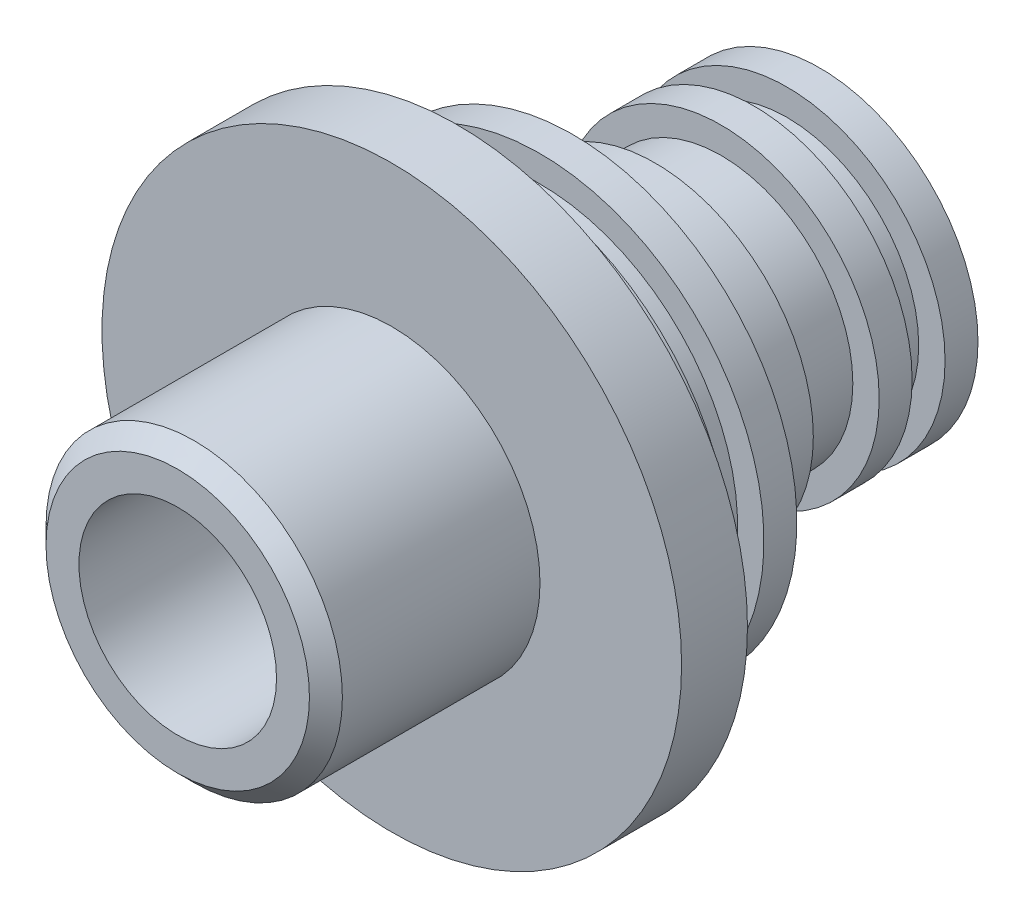
ISO-10303-21;
HEADER;
FILE_DESCRIPTION(('STEP AP214'),'2;1');
FILE_NAME('part.step','',(''),(''),'','','');
FILE_SCHEMA(('AUTOMOTIVE_DESIGN { 1 0 10303 214 1 1 1 1 }'));
ENDSEC;
DATA;
#1=APPLICATION_CONTEXT('core data for automotive mechanical design processes');
#2=APPLICATION_PROTOCOL_DEFINITION('international standard','automotive_design',2000,#1);
#3=PRODUCT_CONTEXT('',#1,'mechanical');
#4=PRODUCT('Part','Part','',(#3));
#5=PRODUCT_RELATED_PRODUCT_CATEGORY('part','',(#4));
#6=PRODUCT_DEFINITION_FORMATION('','',#4);
#7=PRODUCT_DEFINITION_CONTEXT('part definition',#1,'design');
#8=PRODUCT_DEFINITION('design','',#6,#7);
#9=PRODUCT_DEFINITION_SHAPE('','',#8);
#10=(LENGTH_UNIT() NAMED_UNIT(*) SI_UNIT(.MILLI.,.METRE.));
#11=(NAMED_UNIT(*) PLANE_ANGLE_UNIT() SI_UNIT($,.RADIAN.));
#12=(NAMED_UNIT(*) SI_UNIT($,.STERADIAN.) SOLID_ANGLE_UNIT());
#13=UNCERTAINTY_MEASURE_WITH_UNIT(LENGTH_MEASURE(1.E-05),#10,'distance_accuracy_value','');
#14=(GEOMETRIC_REPRESENTATION_CONTEXT(3) GLOBAL_UNCERTAINTY_ASSIGNED_CONTEXT((#13)) GLOBAL_UNIT_ASSIGNED_CONTEXT((#10,
#11,#12)) REPRESENTATION_CONTEXT('',''));
#15=CARTESIAN_POINT('',(0.,0.,0.));
#16=DIRECTION('',(0.,0.,1.));
#17=DIRECTION('',(1.,0.,0.));
#18=AXIS2_PLACEMENT_3D('',#15,#16,#17);
#19=CARTESIAN_POINT('',(0.,0.,7.5));
#20=DIRECTION('',(0.,0.,-1.));
#21=DIRECTION('',(-1.,0.,0.));
#22=AXIS2_PLACEMENT_3D('',#19,#20,#21);
#23=CYLINDRICAL_SURFACE('',#22,4.8);
#24=CARTESIAN_POINT('',(0.,0.,7.5));
#25=DIRECTION('',(0.,0.,-1.));
#26=DIRECTION('',(-1.,0.,0.));
#27=AXIS2_PLACEMENT_3D('',#24,#25,#26);
#28=CIRCLE('',#27,4.8);
#29=CARTESIAN_POINT('',(-4.8,0.,7.5));
#30=VERTEX_POINT('',#29);
#31=EDGE_CURVE('E92',#30,#30,#28,.T.);
#32=ORIENTED_EDGE('',*,*,#31,.T.);
#33=EDGE_LOOP('',(#32));
#34=FACE_BOUND('',#33,.T.);
#35=CARTESIAN_POINT('',(0.,0.,5.));
#36=DIRECTION('',(0.,0.,-1.));
#37=DIRECTION('',(-1.,0.,0.));
#38=AXIS2_PLACEMENT_3D('',#35,#36,#37);
#39=CIRCLE('',#38,4.8);
#40=CARTESIAN_POINT('',(-4.8,0.,5.));
#41=VERTEX_POINT('',#40);
#42=EDGE_CURVE('E64',#41,#41,#39,.F.);
#43=ORIENTED_EDGE('',*,*,#42,.T.);
#44=EDGE_LOOP('',(#43));
#45=FACE_BOUND('',#44,.T.);
#46=ADVANCED_FACE('F45',(#34,#45),#23,.T.);
#47=CARTESIAN_POINT('',(0.,0.,3.));
#48=DIRECTION('',(0.,0.,-1.));
#49=DIRECTION('',(-1.,0.,0.));
#50=AXIS2_PLACEMENT_3D('',#47,#48,#49);
#51=CIRCLE('',#50,4.8);
#52=CARTESIAN_POINT('',(-4.8,0.,3.));
#53=VERTEX_POINT('',#52);
#54=EDGE_CURVE('E68',#53,#53,#51,.F.);
#55=ORIENTED_EDGE('',*,*,#54,.F.);
#56=EDGE_LOOP('',(#55));
#57=FACE_BOUND('',#56,.T.);
#58=CARTESIAN_POINT('',(0.,0.,2.));
#59=DIRECTION('',(0.,0.,-1.));
#60=DIRECTION('',(-1.,0.,0.));
#61=AXIS2_PLACEMENT_3D('',#58,#59,#60);
#62=CIRCLE('',#61,4.8);
#63=CARTESIAN_POINT('',(-4.8,0.,2.));
#64=VERTEX_POINT('',#63);
#65=EDGE_CURVE('E72',#64,#64,#62,.F.);
#66=ORIENTED_EDGE('',*,*,#65,.T.);
#67=EDGE_LOOP('',(#66));
#68=FACE_BOUND('',#67,.T.);
#69=ADVANCED_FACE('F145',(#57,#68),#23,.T.);
#70=CARTESIAN_POINT('',(0.,0.,38.1390602847441));
#71=DIRECTION('',(0.,0.,-1.));
#72=DIRECTION('',(-1.,0.,0.));
#73=AXIS2_PLACEMENT_3D('',#70,#71,#72);
#74=CYLINDRICAL_SURFACE('',#73,6.8);
#75=CARTESIAN_POINT('',(0.,0.,11.));
#76=DIRECTION('',(0.,0.,1.));
#77=DIRECTION('',(1.,0.,0.));
#78=AXIS2_PLACEMENT_3D('',#75,#76,#77);
#79=CIRCLE('',#78,6.8);
#80=CARTESIAN_POINT('',(6.8,0.,11.));
#81=VERTEX_POINT('',#80);
#82=EDGE_CURVE('E91',#81,#81,#79,.F.);
#83=ORIENTED_EDGE('',*,*,#82,.T.);
#84=EDGE_LOOP('',(#83));
#85=FACE_BOUND('',#84,.T.);
#86=CARTESIAN_POINT('',(0.,0.,9.5));
#87=DIRECTION('',(0.,0.,-1.));
#88=DIRECTION('',(-1.,0.,0.));
#89=AXIS2_PLACEMENT_3D('',#86,#87,#88);
#90=CIRCLE('',#89,6.8);
#91=CARTESIAN_POINT('',(-6.8,0.,9.5));
#92=VERTEX_POINT('',#91);
#93=EDGE_CURVE('E80',#92,#92,#90,.F.);
#94=ORIENTED_EDGE('',*,*,#93,.T.);
#95=EDGE_LOOP('',(#94));
#96=FACE_BOUND('',#95,.T.);
#97=ADVANCED_FACE('F152',(#85,#96),#74,.T.);
#98=CARTESIAN_POINT('',(0.,0.,0.));
#99=DIRECTION('',(0.,0.,1.));
#100=DIRECTION('',(1.,0.,0.));
#101=AXIS2_PLACEMENT_3D('',#98,#99,#100);
#102=PLANE('',#101);
#103=CARTESIAN_POINT('',(0.,0.,0.));
#104=DIRECTION('',(0.,0.,1.));
#105=DIRECTION('',(1.,0.,0.));
#106=AXIS2_PLACEMENT_3D('',#103,#104,#105);
#107=CIRCLE('',#106,3.);
#108=CARTESIAN_POINT('',(3.,0.,0.));
#109=VERTEX_POINT('',#108);
#110=EDGE_CURVE('E61',#109,#109,#107,.T.);
#111=ORIENTED_EDGE('',*,*,#110,.T.);
#112=EDGE_LOOP('',(#111));
#113=FACE_BOUND('',#112,.T.);
#114=CARTESIAN_POINT('',(0.,0.,0.));
#115=DIRECTION('',(0.,0.,-1.));
#116=DIRECTION('',(-1.,0.,0.));
#117=AXIS2_PLACEMENT_3D('',#114,#115,#116);
#118=CIRCLE('',#117,4.8);
#119=CARTESIAN_POINT('',(-4.8,0.,0.));
#120=VERTEX_POINT('',#119);
#121=EDGE_CURVE('E83',#120,#120,#118,.T.);
#122=ORIENTED_EDGE('',*,*,#121,.T.);
#123=EDGE_LOOP('',(#122));
#124=FACE_BOUND('',#123,.T.);
#125=ADVANCED_FACE('F174',(#113,#124),#102,.F.);
#126=CARTESIAN_POINT('',(0.,0.,8.5));
#127=DIRECTION('',(0.,0.,-1.));
#128=DIRECTION('',(-1.,0.,0.));
#129=AXIS2_PLACEMENT_3D('',#126,#127,#128);
#130=CIRCLE('',#129,6.8);
#131=CARTESIAN_POINT('',(-6.8,0.,8.5));
#132=VERTEX_POINT('',#131);
#133=EDGE_CURVE('E84',#132,#132,#130,.F.);
#134=ORIENTED_EDGE('',*,*,#133,.F.);
#135=EDGE_LOOP('',(#134));
#136=FACE_BOUND('',#135,.T.);
#137=CARTESIAN_POINT('',(0.,0.,7.5));
#138=DIRECTION('',(0.,0.,-1.));
#139=DIRECTION('',(-1.,0.,0.));
#140=AXIS2_PLACEMENT_3D('',#137,#138,#139);
#141=CIRCLE('',#140,6.8);
#142=CARTESIAN_POINT('',(-6.8,0.,7.5));
#143=VERTEX_POINT('',#142);
#144=EDGE_CURVE('E88',#143,#143,#141,.F.);
#145=ORIENTED_EDGE('',*,*,#144,.T.);
#146=EDGE_LOOP('',(#145));
#147=FACE_BOUND('',#146,.T.);
#148=ADVANCED_FACE('F176',(#136,#147),#74,.T.);
#149=CARTESIAN_POINT('',(0.,0.,19.5));
#150=DIRECTION('',(0.,0.,1.));
#151=DIRECTION('',(1.,0.,0.));
#152=AXIS2_PLACEMENT_3D('',#149,#150,#151);
#153=PLANE('',#152);
#154=CARTESIAN_POINT('',(0.,0.,19.5));
#155=DIRECTION('',(0.,0.,1.));
#156=DIRECTION('',(1.,0.,0.));
#157=AXIS2_PLACEMENT_3D('',#154,#155,#156);
#158=CIRCLE('',#157,4.00000000000001);
#159=CARTESIAN_POINT('',(4.00000000000001,0.,19.5));
#160=VERTEX_POINT('',#159);
#161=EDGE_CURVE('E53',#160,#160,#158,.T.);
#162=ORIENTED_EDGE('',*,*,#161,.T.);
#163=EDGE_LOOP('',(#162));
#164=FACE_BOUND('',#163,.T.);
#165=CARTESIAN_POINT('',(0.,0.,19.5));
#166=DIRECTION('',(0.,0.,1.));
#167=DIRECTION('',(1.,0.,0.));
#168=AXIS2_PLACEMENT_3D('',#165,#166,#167);
#169=CIRCLE('',#168,3.);
#170=CARTESIAN_POINT('',(3.,0.,19.5));
#171=VERTEX_POINT('',#170);
#172=EDGE_CURVE('E57',#171,#171,#169,.T.);
#173=ORIENTED_EDGE('',*,*,#172,.F.);
#174=EDGE_LOOP('',(#173));
#175=FACE_BOUND('',#174,.T.);
#176=ADVANCED_FACE('F183',(#164,#175),#153,.T.);
#177=CARTESIAN_POINT('',(0.,0.,19.5));
#178=DIRECTION('',(0.,0.,-1.));
#179=DIRECTION('',(-1.,0.,0.));
#180=AXIS2_PLACEMENT_3D('',#177,#178,#179);
#181=CYLINDRICAL_SURFACE('',#180,8.8);
#182=CARTESIAN_POINT('',(0.,0.,11.));
#183=DIRECTION('',(0.,0.,1.));
#184=DIRECTION('',(1.,0.,0.));
#185=AXIS2_PLACEMENT_3D('',#182,#183,#184);
#186=CIRCLE('',#185,8.8);
#187=CARTESIAN_POINT('',(8.8,0.,11.));
#188=VERTEX_POINT('',#187);
#189=EDGE_CURVE('E93',#188,#188,#186,.T.);
#190=ORIENTED_EDGE('',*,*,#189,.T.);
#191=EDGE_LOOP('',(#190));
#192=FACE_BOUND('',#191,.T.);
#193=CARTESIAN_POINT('',(0.,0.,13.));
#194=DIRECTION('',(0.,0.,1.));
#195=DIRECTION('',(1.,0.,0.));
#196=AXIS2_PLACEMENT_3D('',#193,#194,#195);
#197=CIRCLE('',#196,8.8);
#198=CARTESIAN_POINT('',(8.8,0.,13.));
#199=VERTEX_POINT('',#198);
#200=EDGE_CURVE('E97',#199,#199,#197,.T.);
#201=ORIENTED_EDGE('',*,*,#200,.F.);
#202=EDGE_LOOP('',(#201));
#203=FACE_BOUND('',#202,.T.);
#204=ADVANCED_FACE('F189',(#192,#203),#181,.T.);
#205=CARTESIAN_POINT('',(0.,0.,19.5));
#206=DIRECTION('',(0.,0.,-1.));
#207=DIRECTION('',(-1.,0.,0.));
#208=AXIS2_PLACEMENT_3D('',#205,#206,#207);
#209=CYLINDRICAL_SURFACE('',#208,3.);
#210=ORIENTED_EDGE('',*,*,#172,.T.);
#211=EDGE_LOOP('',(#210));
#212=FACE_BOUND('',#211,.T.);
#213=ORIENTED_EDGE('',*,*,#110,.F.);
#214=EDGE_LOOP('',(#213));
#215=FACE_BOUND('',#214,.T.);
#216=ADVANCED_FACE('F191',(#212,#215),#209,.F.);
#217=CARTESIAN_POINT('',(0.,0.,13.));
#218=DIRECTION('',(0.,0.,1.));
#219=DIRECTION('',(1.,0.,0.));
#220=AXIS2_PLACEMENT_3D('',#217,#218,#219);
#221=PLANE('',#220);
#222=CARTESIAN_POINT('',(0.,0.,13.));
#223=DIRECTION('',(0.,0.,1.));
#224=DIRECTION('',(1.,0.,0.));
#225=AXIS2_PLACEMENT_3D('',#222,#223,#224);
#226=CIRCLE('',#225,4.5);
#227=CARTESIAN_POINT('',(4.5,0.,13.));
#228=VERTEX_POINT('',#227);
#229=EDGE_CURVE('E96',#228,#228,#226,.T.);
#230=ORIENTED_EDGE('',*,*,#229,.F.);
#231=EDGE_LOOP('',(#230));
#232=FACE_BOUND('',#231,.T.);
#233=ORIENTED_EDGE('',*,*,#200,.T.);
#234=EDGE_LOOP('',(#233));
#235=FACE_BOUND('',#234,.T.);
#236=ADVANCED_FACE('F197',(#232,#235),#221,.T.);
#237=CARTESIAN_POINT('',(0.,0.,13.));
#238=DIRECTION('',(0.,0.,1.));
#239=DIRECTION('',(1.,0.,0.));
#240=AXIS2_PLACEMENT_3D('',#237,#238,#239);
#241=CYLINDRICAL_SURFACE('',#240,4.5);
#242=CARTESIAN_POINT('',(0.,0.,19.));
#243=DIRECTION('',(0.,0.,1.));
#244=DIRECTION('',(1.,0.,0.));
#245=AXIS2_PLACEMENT_3D('',#242,#243,#244);
#246=CIRCLE('',#245,4.5);
#247=CARTESIAN_POINT('',(4.5,0.,19.));
#248=VERTEX_POINT('',#247);
#249=EDGE_CURVE('E12',#248,#248,#246,.F.);
#250=CARTESIAN_POINT('',(4.5,0.,19.));
#251=CARTESIAN_POINT('',(4.5,0.,18.9375));
#252=CARTESIAN_POINT('',(4.5,0.,18.875));
#253=CARTESIAN_POINT('',(4.5,0.,18.75));
#254=CARTESIAN_POINT('',(4.5,0.,18.6875));
#255=CARTESIAN_POINT('',(4.5,0.,18.5625));
#256=CARTESIAN_POINT('',(4.5,0.,18.5));
#257=CARTESIAN_POINT('',(4.5,0.,18.375));
#258=CARTESIAN_POINT('',(4.5,0.,18.3125));
#259=CARTESIAN_POINT('',(4.5,0.,18.1875));
#260=CARTESIAN_POINT('',(4.5,0.,18.125));
#261=CARTESIAN_POINT('',(4.5,0.,18.));
#262=CARTESIAN_POINT('',(4.5,0.,17.9375));
#263=CARTESIAN_POINT('',(4.5,0.,17.8125));
#264=CARTESIAN_POINT('',(4.5,0.,17.75));
#265=CARTESIAN_POINT('',(4.5,0.,17.625));
#266=CARTESIAN_POINT('',(4.5,0.,17.5625));
#267=CARTESIAN_POINT('',(4.5,0.,17.4375));
#268=CARTESIAN_POINT('',(4.5,0.,17.375));
#269=CARTESIAN_POINT('',(4.5,0.,17.25));
#270=CARTESIAN_POINT('',(4.5,0.,17.1875));
#271=CARTESIAN_POINT('',(4.5,0.,17.0625));
#272=CARTESIAN_POINT('',(4.5,0.,17.));
#273=CARTESIAN_POINT('',(4.5,0.,16.875));
#274=CARTESIAN_POINT('',(4.5,0.,16.8125));
#275=CARTESIAN_POINT('',(4.5,0.,16.6875));
#276=CARTESIAN_POINT('',(4.5,0.,16.625));
#277=CARTESIAN_POINT('',(4.5,0.,16.5));
#278=CARTESIAN_POINT('',(4.5,0.,16.4375));
#279=CARTESIAN_POINT('',(4.5,0.,16.3125));
#280=CARTESIAN_POINT('',(4.5,0.,16.25));
#281=CARTESIAN_POINT('',(4.5,0.,16.125));
#282=CARTESIAN_POINT('',(4.5,0.,16.0625));
#283=CARTESIAN_POINT('',(4.5,0.,15.9375));
#284=CARTESIAN_POINT('',(4.5,0.,15.875));
#285=CARTESIAN_POINT('',(4.5,0.,15.75));
#286=CARTESIAN_POINT('',(4.5,0.,15.6875));
#287=CARTESIAN_POINT('',(4.5,0.,15.5625));
#288=CARTESIAN_POINT('',(4.5,0.,15.5));
#289=CARTESIAN_POINT('',(4.5,0.,15.375));
#290=CARTESIAN_POINT('',(4.5,0.,15.3125));
#291=CARTESIAN_POINT('',(4.5,0.,15.1875));
#292=CARTESIAN_POINT('',(4.5,0.,15.125));
#293=CARTESIAN_POINT('',(4.5,0.,15.));
#294=CARTESIAN_POINT('',(4.5,0.,14.9375));
#295=CARTESIAN_POINT('',(4.5,0.,14.8125));
#296=CARTESIAN_POINT('',(4.5,0.,14.75));
#297=CARTESIAN_POINT('',(4.5,0.,14.625));
#298=CARTESIAN_POINT('',(4.5,0.,14.5625));
#299=CARTESIAN_POINT('',(4.5,0.,14.4375));
#300=CARTESIAN_POINT('',(4.5,0.,14.375));
#301=CARTESIAN_POINT('',(4.5,0.,14.25));
#302=CARTESIAN_POINT('',(4.5,0.,14.1875));
#303=CARTESIAN_POINT('',(4.5,0.,14.0625));
#304=CARTESIAN_POINT('',(4.5,0.,14.));
#305=CARTESIAN_POINT('',(4.5,0.,13.875));
#306=CARTESIAN_POINT('',(4.5,0.,13.8125));
#307=CARTESIAN_POINT('',(4.5,0.,13.6875));
#308=CARTESIAN_POINT('',(4.5,0.,13.625));
#309=CARTESIAN_POINT('',(4.5,0.,13.5));
#310=CARTESIAN_POINT('',(4.5,0.,13.4375));
#311=CARTESIAN_POINT('',(4.5,0.,13.3125));
#312=CARTESIAN_POINT('',(4.5,0.,13.25));
#313=CARTESIAN_POINT('',(4.5,0.,13.125));
#314=CARTESIAN_POINT('',(4.5,0.,13.0625));
#315=CARTESIAN_POINT('',(4.5,0.,13.));
#316=B_SPLINE_CURVE_WITH_KNOTS('',3,(#250,#251,#252,#253,#254,#255,#256,#257,#258,#259,#260,
#261,#262,#263,#264,#265,#266,#267,#268,#269,#270,#271,#272,#273,#274,#275,#276,#277,#278,#279,
#280,#281,#282,#283,#284,#285,#286,#287,#288,#289,#290,#291,#292,#293,#294,#295,#296,#297,#298,
#299,#300,#301,#302,#303,#304,#305,#306,#307,#308,#309,#310,#311,#312,#313,#314,#315),
.UNSPECIFIED.,.F.,.F.,(4,2,2,2,2,2,2,2,2,2,2,2,2,2,2,2,2,2,2,2,2,2,2,2,2,2,2,2,2,2,2,2,4),(0.,
0.1875,0.375000000000004,0.562500000000004,0.750000000000004,0.937500000000004,1.125,1.3125,1.5,
1.6875,1.87500000000001,2.06250000000001,2.25000000000001,2.43750000000001,2.62500000000001,
2.81250000000001,3.00000000000001,3.18750000000001,3.37500000000001,3.56250000000001,
3.75000000000001,3.93750000000001,4.12500000000001,4.31250000000001,4.50000000000001,
4.68750000000001,4.87500000000001,5.06250000000001,5.25000000000001,5.43750000000001,
5.62500000000001,5.81250000000001,6.00000000000001),.UNSPECIFIED.);
#317=EDGE_CURVE('BSEAM204',#248,#228,#316,.T.);
#318=ORIENTED_EDGE('',*,*,#249,.T.);
#319=ORIENTED_EDGE('',*,*,#229,.T.);
#320=ORIENTED_EDGE('',*,*,#317,.T.);
#321=ORIENTED_EDGE('',*,*,#317,.F.);
#322=EDGE_LOOP('',(#318,#320,#319,#321));
#323=FACE_BOUND('',#322,.T.);
#324=ADVANCED_FACE('F204',(#323),#241,.T.);
#325=CARTESIAN_POINT('',(0.,0.,11.));
#326=DIRECTION('',(0.,0.,1.));
#327=DIRECTION('',(1.,0.,0.));
#328=AXIS2_PLACEMENT_3D('',#325,#326,#327);
#329=PLANE('',#328);
#330=ORIENTED_EDGE('',*,*,#82,.F.);
#331=EDGE_LOOP('',(#330));
#332=FACE_BOUND('',#331,.T.);
#333=ORIENTED_EDGE('',*,*,#189,.F.);
#334=EDGE_LOOP('',(#333));
#335=FACE_BOUND('',#334,.T.);
#336=ADVANCED_FACE('F168',(#332,#335),#329,.F.);
#337=CARTESIAN_POINT('',(0.,0.,7.5));
#338=DIRECTION('',(0.,0.,-1.));
#339=DIRECTION('',(-1.,0.,0.));
#340=AXIS2_PLACEMENT_3D('',#337,#338,#339);
#341=PLANE('',#340);
#342=ORIENTED_EDGE('',*,*,#144,.F.);
#343=EDGE_LOOP('',(#342));
#344=FACE_BOUND('',#343,.T.);
#345=ORIENTED_EDGE('',*,*,#31,.F.);
#346=EDGE_LOOP('',(#345));
#347=FACE_BOUND('',#346,.T.);
#348=ADVANCED_FACE('F159',(#344,#347),#341,.T.);
#349=CARTESIAN_POINT('',(0.,0.,1.));
#350=DIRECTION('',(0.,0.,-1.));
#351=DIRECTION('',(-1.,0.,0.));
#352=AXIS2_PLACEMENT_3D('',#349,#350,#351);
#353=CIRCLE('',#352,4.8);
#354=CARTESIAN_POINT('',(-4.8,0.,1.));
#355=VERTEX_POINT('',#354);
#356=EDGE_CURVE('E76',#355,#355,#353,.F.);
#357=ORIENTED_EDGE('',*,*,#356,.F.);
#358=EDGE_LOOP('',(#357));
#359=FACE_BOUND('',#358,.T.);
#360=ORIENTED_EDGE('',*,*,#121,.F.);
#361=EDGE_LOOP('',(#360));
#362=FACE_BOUND('',#361,.T.);
#363=ADVANCED_FACE('F148',(#359,#362),#23,.T.);
#364=CARTESIAN_POINT('',(0.,0.,9.5));
#365=DIRECTION('',(0.,0.,-1.));
#366=DIRECTION('',(-1.,0.,0.));
#367=AXIS2_PLACEMENT_3D('',#364,#365,#366);
#368=PLANE('',#367);
#369=ORIENTED_EDGE('',*,*,#93,.F.);
#370=EDGE_LOOP('',(#369));
#371=FACE_BOUND('',#370,.T.);
#372=CARTESIAN_POINT('',(0.,0.,9.5));
#373=DIRECTION('',(0.,0.,-1.));
#374=DIRECTION('',(-1.,0.,0.));
#375=AXIS2_PLACEMENT_3D('',#372,#373,#374);
#376=CIRCLE('',#375,6.);
#377=CARTESIAN_POINT('',(-6.,0.,9.5));
#378=VERTEX_POINT('',#377);
#379=EDGE_CURVE('E87',#378,#378,#376,.T.);
#380=ORIENTED_EDGE('',*,*,#379,.F.);
#381=EDGE_LOOP('',(#380));
#382=FACE_BOUND('',#381,.T.);
#383=ADVANCED_FACE('F158',(#371,#382),#368,.T.);
#384=CARTESIAN_POINT('',(0.,0.,8.5));
#385=DIRECTION('',(0.,0.,-1.));
#386=DIRECTION('',(-1.,0.,0.));
#387=AXIS2_PLACEMENT_3D('',#384,#385,#386);
#388=PLANE('',#387);
#389=ORIENTED_EDGE('',*,*,#133,.T.);
#390=EDGE_LOOP('',(#389));
#391=FACE_BOUND('',#390,.T.);
#392=CARTESIAN_POINT('',(0.,0.,8.5));
#393=DIRECTION('',(0.,0.,-1.));
#394=DIRECTION('',(-1.,0.,0.));
#395=AXIS2_PLACEMENT_3D('',#392,#393,#394);
#396=CIRCLE('',#395,6.);
#397=CARTESIAN_POINT('',(-6.,0.,8.5));
#398=VERTEX_POINT('',#397);
#399=EDGE_CURVE('E75',#398,#398,#396,.T.);
#400=ORIENTED_EDGE('',*,*,#399,.T.);
#401=EDGE_LOOP('',(#400));
#402=FACE_BOUND('',#401,.T.);
#403=ADVANCED_FACE('F165',(#391,#402),#388,.F.);
#404=CARTESIAN_POINT('',(0.,0.,9.5));
#405=DIRECTION('',(0.,0.,-1.));
#406=DIRECTION('',(-1.,0.,0.));
#407=AXIS2_PLACEMENT_3D('',#404,#405,#406);
#408=CYLINDRICAL_SURFACE('',#407,6.);
#409=ORIENTED_EDGE('',*,*,#379,.T.);
#410=EDGE_LOOP('',(#409));
#411=FACE_BOUND('',#410,.T.);
#412=ORIENTED_EDGE('',*,*,#399,.F.);
#413=EDGE_LOOP('',(#412));
#414=FACE_BOUND('',#413,.T.);
#415=ADVANCED_FACE('F224',(#411,#414),#408,.T.);
#416=CARTESIAN_POINT('',(0.,0.,2.));
#417=DIRECTION('',(0.,0.,-1.));
#418=DIRECTION('',(-1.,0.,0.));
#419=AXIS2_PLACEMENT_3D('',#416,#417,#418);
#420=PLANE('',#419);
#421=ORIENTED_EDGE('',*,*,#65,.F.);
#422=EDGE_LOOP('',(#421));
#423=FACE_BOUND('',#422,.T.);
#424=CARTESIAN_POINT('',(0.,0.,2.));
#425=DIRECTION('',(0.,0.,-1.));
#426=DIRECTION('',(-1.,0.,0.));
#427=AXIS2_PLACEMENT_3D('',#424,#425,#426);
#428=CIRCLE('',#427,4.);
#429=CARTESIAN_POINT('',(-4.,0.,2.));
#430=VERTEX_POINT('',#429);
#431=EDGE_CURVE('E79',#430,#430,#428,.T.);
#432=ORIENTED_EDGE('',*,*,#431,.F.);
#433=EDGE_LOOP('',(#432));
#434=FACE_BOUND('',#433,.T.);
#435=ADVANCED_FACE('F227',(#423,#434),#420,.T.);
#436=CARTESIAN_POINT('',(0.,0.,1.));
#437=DIRECTION('',(0.,0.,-1.));
#438=DIRECTION('',(-1.,0.,0.));
#439=AXIS2_PLACEMENT_3D('',#436,#437,#438);
#440=PLANE('',#439);
#441=ORIENTED_EDGE('',*,*,#356,.T.);
#442=EDGE_LOOP('',(#441));
#443=FACE_BOUND('',#442,.T.);
#444=CARTESIAN_POINT('',(0.,0.,1.));
#445=DIRECTION('',(0.,0.,-1.));
#446=DIRECTION('',(-1.,0.,0.));
#447=AXIS2_PLACEMENT_3D('',#444,#445,#446);
#448=CIRCLE('',#447,4.);
#449=CARTESIAN_POINT('',(-4.,0.,1.));
#450=VERTEX_POINT('',#449);
#451=EDGE_CURVE('E67',#450,#450,#448,.T.);
#452=ORIENTED_EDGE('',*,*,#451,.T.);
#453=EDGE_LOOP('',(#452));
#454=FACE_BOUND('',#453,.T.);
#455=ADVANCED_FACE('F139',(#443,#454),#440,.F.);
#456=CARTESIAN_POINT('',(0.,0.,2.));
#457=DIRECTION('',(0.,0.,-1.));
#458=DIRECTION('',(-1.,0.,0.));
#459=AXIS2_PLACEMENT_3D('',#456,#457,#458);
#460=CYLINDRICAL_SURFACE('',#459,4.);
#461=ORIENTED_EDGE('',*,*,#431,.T.);
#462=EDGE_LOOP('',(#461));
#463=FACE_BOUND('',#462,.T.);
#464=ORIENTED_EDGE('',*,*,#451,.F.);
#465=EDGE_LOOP('',(#464));
#466=FACE_BOUND('',#465,.T.);
#467=ADVANCED_FACE('F130',(#463,#466),#460,.T.);
#468=CARTESIAN_POINT('',(0.,0.,5.));
#469=DIRECTION('',(0.,0.,-1.));
#470=DIRECTION('',(-1.,0.,0.));
#471=AXIS2_PLACEMENT_3D('',#468,#469,#470);
#472=PLANE('',#471);
#473=ORIENTED_EDGE('',*,*,#42,.F.);
#474=EDGE_LOOP('',(#473));
#475=FACE_BOUND('',#474,.T.);
#476=CARTESIAN_POINT('',(0.,0.,5.));
#477=DIRECTION('',(0.,0.,-1.));
#478=DIRECTION('',(-1.,0.,0.));
#479=AXIS2_PLACEMENT_3D('',#476,#477,#478);
#480=CIRCLE('',#479,4.);
#481=CARTESIAN_POINT('',(-4.,0.,5.));
#482=VERTEX_POINT('',#481);
#483=EDGE_CURVE('E71',#482,#482,#480,.T.);
#484=ORIENTED_EDGE('',*,*,#483,.F.);
#485=EDGE_LOOP('',(#484));
#486=FACE_BOUND('',#485,.T.);
#487=ADVANCED_FACE('F127',(#475,#486),#472,.T.);
#488=CARTESIAN_POINT('',(0.,0.,3.));
#489=DIRECTION('',(0.,0.,-1.));
#490=DIRECTION('',(-1.,0.,0.));
#491=AXIS2_PLACEMENT_3D('',#488,#489,#490);
#492=PLANE('',#491);
#493=ORIENTED_EDGE('',*,*,#54,.T.);
#494=EDGE_LOOP('',(#493));
#495=FACE_BOUND('',#494,.T.);
#496=CARTESIAN_POINT('',(0.,0.,3.));
#497=DIRECTION('',(0.,0.,-1.));
#498=DIRECTION('',(-1.,0.,0.));
#499=AXIS2_PLACEMENT_3D('',#496,#497,#498);
#500=CIRCLE('',#499,4.);
#501=CARTESIAN_POINT('',(-4.,0.,3.));
#502=VERTEX_POINT('',#501);
#503=EDGE_CURVE('E118',#502,#502,#500,.T.);
#504=ORIENTED_EDGE('',*,*,#503,.T.);
#505=EDGE_LOOP('',(#504));
#506=FACE_BOUND('',#505,.T.);
#507=ADVANCED_FACE('F129',(#495,#506),#492,.F.);
#508=CARTESIAN_POINT('',(0.,0.,5.));
#509=DIRECTION('',(0.,0.,-1.));
#510=DIRECTION('',(-1.,0.,0.));
#511=AXIS2_PLACEMENT_3D('',#508,#509,#510);
#512=CYLINDRICAL_SURFACE('',#511,4.);
#513=ORIENTED_EDGE('',*,*,#483,.T.);
#514=EDGE_LOOP('',(#513));
#515=FACE_BOUND('',#514,.T.);
#516=ORIENTED_EDGE('',*,*,#503,.F.);
#517=EDGE_LOOP('',(#516));
#518=FACE_BOUND('',#517,.T.);
#519=ADVANCED_FACE('F124',(#515,#518),#512,.T.);
#520=CARTESIAN_POINT('',(0.,0.,19.5));
#521=DIRECTION('',(0.,0.,-1.));
#522=DIRECTION('',(-1.,0.,0.));
#523=AXIS2_PLACEMENT_3D('',#520,#521,#522);
#524=CONICAL_SURFACE('',#523,4.00000000000001,0.785398163397452);
#525=ORIENTED_EDGE('',*,*,#249,.F.);
#526=EDGE_LOOP('',(#525));
#527=FACE_BOUND('',#526,.T.);
#528=ORIENTED_EDGE('',*,*,#161,.F.);
#529=EDGE_LOOP('',(#528));
#530=FACE_BOUND('',#529,.T.);
#531=ADVANCED_FACE('F48',(#527,#530),#524,.T.);
#532=CLOSED_SHELL('',(#46,#69,#97,#125,#148,#176,#204,#216,#236,#324,#336,#348,#363,#383,#403,
#415,#435,#455,#467,#487,#507,#519,#531));
#533=MANIFOLD_SOLID_BREP('B2',#532);
#534=ADVANCED_BREP_SHAPE_REPRESENTATION('',(#18,#533),#14);
#535=SHAPE_DEFINITION_REPRESENTATION(#9,#534);
ENDSEC;
END-ISO-10303-21;
